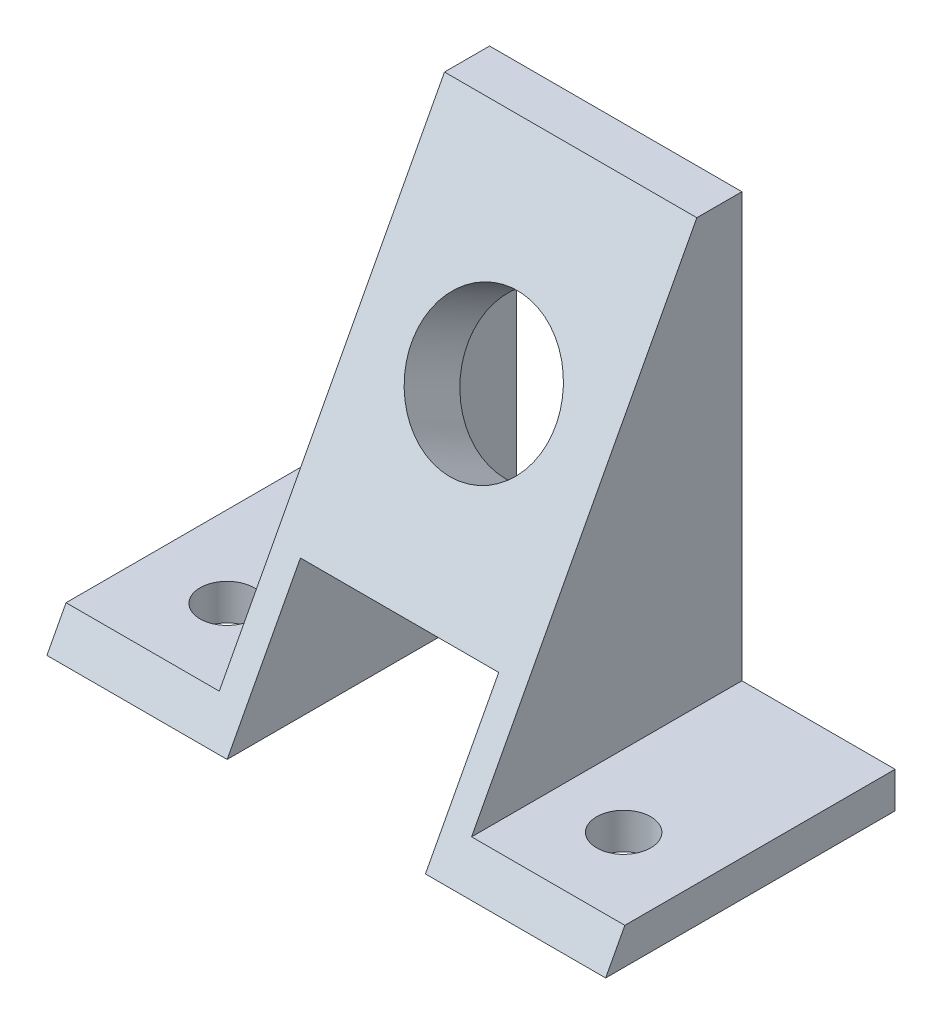
ISO-10303-21;
HEADER;
FILE_DESCRIPTION(('STEP AP214'),'2;1');
FILE_NAME('part.step','',(''),(''),'','','');
FILE_SCHEMA(('AUTOMOTIVE_DESIGN { 1 0 10303 214 1 1 1 1 }'));
ENDSEC;
DATA;
#1=APPLICATION_CONTEXT('core data for automotive mechanical design processes');
#2=APPLICATION_PROTOCOL_DEFINITION('international standard','automotive_design',2000,#1);
#3=PRODUCT_CONTEXT('',#1,'mechanical');
#4=PRODUCT('Part','Part','',(#3));
#5=PRODUCT_RELATED_PRODUCT_CATEGORY('part','',(#4));
#6=PRODUCT_DEFINITION_FORMATION('','',#4);
#7=PRODUCT_DEFINITION_CONTEXT('part definition',#1,'design');
#8=PRODUCT_DEFINITION('design','',#6,#7);
#9=PRODUCT_DEFINITION_SHAPE('','',#8);
#10=(LENGTH_UNIT() NAMED_UNIT(*) SI_UNIT(.MILLI.,.METRE.));
#11=(NAMED_UNIT(*) PLANE_ANGLE_UNIT() SI_UNIT($,.RADIAN.));
#12=(NAMED_UNIT(*) SI_UNIT($,.STERADIAN.) SOLID_ANGLE_UNIT());
#13=UNCERTAINTY_MEASURE_WITH_UNIT(LENGTH_MEASURE(1.E-05),#10,'distance_accuracy_value','');
#14=(GEOMETRIC_REPRESENTATION_CONTEXT(3) GLOBAL_UNCERTAINTY_ASSIGNED_CONTEXT((#13)) GLOBAL_UNIT_ASSIGNED_CONTEXT((#10,
#11,#12)) REPRESENTATION_CONTEXT('',''));
#15=CARTESIAN_POINT('',(0.,0.,0.));
#16=DIRECTION('',(0.,0.,1.));
#17=DIRECTION('',(1.,0.,0.));
#18=AXIS2_PLACEMENT_3D('',#15,#16,#17);
#19=CARTESIAN_POINT('',(14.,-7.67109937307166,-13.3100752591535));
#20=DIRECTION('',(0.,1.,0.));
#21=DIRECTION('',(0.,0.,1.));
#22=AXIS2_PLACEMENT_3D('',#19,#20,#21);
#23=PLANE('',#22);
#24=CARTESIAN_POINT('',(22.,-7.67109937307166,2.80710575558222));
#25=DIRECTION('',(0.,1.,0.));
#26=DIRECTION('',(0.,0.,1.));
#27=AXIS2_PLACEMENT_3D('',#24,#25,#26);
#28=CIRCLE('',#27,3.);
#29=CARTESIAN_POINT('',(22.,-7.67109937307167,5.80710575558222));
#30=VERTEX_POINT('',#29);
#31=EDGE_CURVE('E165',#30,#30,#28,.T.);
#32=ORIENTED_EDGE('',*,*,#31,.T.);
#33=EDGE_LOOP('',(#32));
#34=FACE_BOUND('',#33,.T.);
#35=DIRECTION('',(-1.,0.,0.));
#36=VECTOR('',#35,1.);
#37=CARTESIAN_POINT('',(14.,-7.67109937307167,13.8071057555822));
#38=LINE('',#37,#36);
#39=CARTESIAN_POINT('',(31.,-7.67109937307167,13.8071057555822));
#40=VERTEX_POINT('',#39);
#41=CARTESIAN_POINT('',(11.,-7.67109937307166,13.8071057555822));
#42=VERTEX_POINT('',#41);
#43=EDGE_CURVE('E142',#40,#42,#38,.T.);
#44=ORIENTED_EDGE('',*,*,#43,.T.);
#45=DIRECTION('',(0.,0.,1.));
#46=VECTOR('',#45,1.);
#47=CARTESIAN_POINT('',(11.,-7.67109937307166,-13.3100752591535));
#48=LINE('',#47,#46);
#49=CARTESIAN_POINT('',(11.,-7.67109937307166,-18.3100752591535));
#50=VERTEX_POINT('',#49);
#51=EDGE_CURVE('E211',#50,#42,#48,.T.);
#52=ORIENTED_EDGE('',*,*,#51,.F.);
#53=DIRECTION('',(-1.,0.,0.));
#54=VECTOR('',#53,1.);
#55=CARTESIAN_POINT('',(14.,-7.67109937307166,-18.3100752591535));
#56=LINE('',#55,#54);
#57=CARTESIAN_POINT('',(31.,-7.67109937307166,-18.3100752591535));
#58=VERTEX_POINT('',#57);
#59=EDGE_CURVE('E220',#58,#50,#56,.T.);
#60=ORIENTED_EDGE('',*,*,#59,.F.);
#61=DIRECTION('',(0.,0.,-1.));
#62=VECTOR('',#61,1.);
#63=CARTESIAN_POINT('',(31.,-7.67109937307166,-18.3100752591535));
#64=LINE('',#63,#62);
#65=EDGE_CURVE('E168',#40,#58,#64,.T.);
#66=ORIENTED_EDGE('',*,*,#65,.F.);
#67=EDGE_LOOP('',(#44,#52,#60,#66));
#68=FACE_BOUND('',#67,.T.);
#69=ADVANCED_FACE('F33',(#34,#68),#23,.F.);
#70=CARTESIAN_POINT('',(-22.,-7.67109937307166,2.80710575558222));
#71=DIRECTION('',(0.,1.,0.));
#72=DIRECTION('',(0.,0.,1.));
#73=AXIS2_PLACEMENT_3D('',#70,#71,#72);
#74=CIRCLE('',#73,3.);
#75=CARTESIAN_POINT('',(-22.,-7.67109937307167,5.80710575558222));
#76=VERTEX_POINT('',#75);
#77=EDGE_CURVE('E241',#76,#76,#74,.T.);
#78=ORIENTED_EDGE('',*,*,#77,.T.);
#79=EDGE_LOOP('',(#78));
#80=FACE_BOUND('',#79,.T.);
#81=DIRECTION('',(0.,0.,1.));
#82=VECTOR('',#81,1.);
#83=CARTESIAN_POINT('',(-11.,-7.67109937307166,-13.3100752591535));
#84=LINE('',#83,#82);
#85=CARTESIAN_POINT('',(-11.,-7.67109937307166,-18.3100752591535));
#86=VERTEX_POINT('',#85);
#87=CARTESIAN_POINT('',(-11.,-7.67109937307166,13.8071057555822));
#88=VERTEX_POINT('',#87);
#89=EDGE_CURVE('E137',#86,#88,#84,.T.);
#90=ORIENTED_EDGE('',*,*,#89,.T.);
#91=CARTESIAN_POINT('',(-31.,-7.67109937307167,13.8071057555822));
#92=VERTEX_POINT('',#91);
#93=EDGE_CURVE('E132',#88,#92,#38,.T.);
#94=ORIENTED_EDGE('',*,*,#93,.T.);
#95=DIRECTION('',(0.,0.,-1.));
#96=VECTOR('',#95,1.);
#97=CARTESIAN_POINT('',(-31.,-7.67109937307166,-18.3100752591535));
#98=LINE('',#97,#96);
#99=CARTESIAN_POINT('',(-31.,-7.67109937307166,-18.3100752591535));
#100=VERTEX_POINT('',#99);
#101=EDGE_CURVE('E135',#92,#100,#98,.T.);
#102=ORIENTED_EDGE('',*,*,#101,.T.);
#103=EDGE_CURVE('E219',#86,#100,#56,.T.);
#104=ORIENTED_EDGE('',*,*,#103,.F.);
#105=EDGE_LOOP('',(#90,#94,#102,#104));
#106=FACE_BOUND('',#105,.T.);
#107=ADVANCED_FACE('F35',(#80,#106),#23,.F.);
#108=CARTESIAN_POINT('',(14.,-7.67109937307167,13.8071057555822));
#109=DIRECTION('',(0.,-0.469471562785895,-0.882947592858925));
#110=DIRECTION('',(0.,0.882947592858925,-0.469471562785895));
#111=AXIS2_PLACEMENT_3D('',#108,#109,#110);
#112=PLANE('',#111);
#113=CARTESIAN_POINT('',(0.,25.1973327477471,-3.66934960698242));
#114=DIRECTION('',(0.,0.469471562785895,0.882947592858925));
#115=DIRECTION('',(0.,-0.882947592858925,0.469471562785895));
#116=AXIS2_PLACEMENT_3D('',#113,#114,#115);
#117=CIRCLE('',#116,8.);
#118=CARTESIAN_POINT('',(0.,18.1337520048757,0.0864228953047354));
#119=VERTEX_POINT('',#118);
#120=EDGE_CURVE('E214',#119,#119,#117,.T.);
#121=ORIENTED_EDGE('',*,*,#120,.F.);
#122=EDGE_LOOP('',(#121));
#123=FACE_BOUND('',#122,.T.);
#124=DIRECTION('',(1.,0.,0.));
#125=VECTOR('',#124,1.);
#126=CARTESIAN_POINT('',(14.,7.62551807535707,5.67374998573502));
#127=LINE('',#126,#125);
#128=CARTESIAN_POINT('',(-11.,7.62551807535708,5.67374998573502));
#129=VERTEX_POINT('',#128);
#130=CARTESIAN_POINT('',(11.,7.62551807535707,5.67374998573502));
#131=VERTEX_POINT('',#130);
#132=EDGE_CURVE('E192',#129,#131,#127,.T.);
#133=ORIENTED_EDGE('',*,*,#132,.T.);
#134=DIRECTION('',(0.,-0.882947592858925,0.469471562785895));
#135=VECTOR('',#134,1.);
#136=CARTESIAN_POINT('',(11.,-7.67109937307167,13.8071057555822));
#137=LINE('',#136,#135);
#138=EDGE_CURVE('E194',#131,#42,#137,.T.);
#139=ORIENTED_EDGE('',*,*,#138,.T.);
#140=ORIENTED_EDGE('',*,*,#43,.F.);
#141=DIRECTION('',(0.,-0.882947592858925,0.469471562785895));
#142=VECTOR('',#141,1.);
#143=CARTESIAN_POINT('',(31.,-7.67109937307167,13.8071057555822));
#144=LINE('',#143,#142);
#145=CARTESIAN_POINT('',(31.,-3.67109937307166,11.6802680289363));
#146=VERTEX_POINT('',#145);
#147=EDGE_CURVE('E175',#146,#40,#144,.T.);
#148=ORIENTED_EDGE('',*,*,#147,.F.);
#149=DIRECTION('',(-1.,0.,0.));
#150=VECTOR('',#149,1.);
#151=CARTESIAN_POINT('',(31.,-3.67109937307166,11.6802680289363));
#152=LINE('',#151,#150);
#153=CARTESIAN_POINT('',(14.,-3.67109937307166,11.6802680289363));
#154=VERTEX_POINT('',#153);
#155=EDGE_CURVE('E178',#146,#154,#152,.T.);
#156=ORIENTED_EDGE('',*,*,#155,.T.);
#157=DIRECTION('',(0.,-0.882947592858925,0.469471562785895));
#158=VECTOR('',#157,1.);
#159=CARTESIAN_POINT('',(14.,-7.67109937307167,13.8071057555822));
#160=LINE('',#159,#158);
#161=CARTESIAN_POINT('',(14.,43.3289006269283,-13.3100752591535));
#162=VERTEX_POINT('',#161);
#163=EDGE_CURVE('E143',#162,#154,#160,.T.);
#164=ORIENTED_EDGE('',*,*,#163,.F.);
#165=DIRECTION('',(-1.,0.,0.));
#166=VECTOR('',#165,1.);
#167=CARTESIAN_POINT('',(14.,43.3289006269283,-13.3100752591535));
#168=LINE('',#167,#166);
#169=CARTESIAN_POINT('',(-14.,43.3289006269283,-13.3100752591535));
#170=VERTEX_POINT('',#169);
#171=EDGE_CURVE('E42',#162,#170,#168,.T.);
#172=ORIENTED_EDGE('',*,*,#171,.T.);
#173=DIRECTION('',(0.,-0.882947592858925,0.469471562785895));
#174=VECTOR('',#173,1.);
#175=CARTESIAN_POINT('',(-14.,-7.67109937307167,13.8071057555822));
#176=LINE('',#175,#174);
#177=CARTESIAN_POINT('',(-14.,-3.67109937307166,11.6802680289363));
#178=VERTEX_POINT('',#177);
#179=EDGE_CURVE('E233',#170,#178,#176,.T.);
#180=ORIENTED_EDGE('',*,*,#179,.T.);
#181=DIRECTION('',(1.,0.,0.));
#182=VECTOR('',#181,1.);
#183=CARTESIAN_POINT('',(-31.,-3.67109937307166,11.6802680289363));
#184=LINE('',#183,#182);
#185=CARTESIAN_POINT('',(-31.,-3.67109937307166,11.6802680289363));
#186=VERTEX_POINT('',#185);
#187=EDGE_CURVE('E50',#186,#178,#184,.T.);
#188=ORIENTED_EDGE('',*,*,#187,.F.);
#189=DIRECTION('',(0.,-0.882947592858925,0.469471562785895));
#190=VECTOR('',#189,1.);
#191=CARTESIAN_POINT('',(-31.,-7.67109937307167,13.8071057555822));
#192=LINE('',#191,#190);
#193=EDGE_CURVE('E149',#186,#92,#192,.T.);
#194=ORIENTED_EDGE('',*,*,#193,.T.);
#195=ORIENTED_EDGE('',*,*,#93,.F.);
#196=DIRECTION('',(0.,0.882947592858925,-0.469471562785895));
#197=VECTOR('',#196,1.);
#198=CARTESIAN_POINT('',(-11.,-7.67109937307167,13.8071057555822));
#199=LINE('',#198,#197);
#200=EDGE_CURVE('E189',#88,#129,#199,.T.);
#201=ORIENTED_EDGE('',*,*,#200,.T.);
#202=EDGE_LOOP('',(#133,#139,#140,#148,#156,#164,#172,#180,#188,#194,#195,#201));
#203=FACE_BOUND('',#202,.T.);
#204=ADVANCED_FACE('F155',(#123,#203),#112,.F.);
#205=CARTESIAN_POINT('',(14.,0.,0.));
#206=DIRECTION('',(1.,0.,0.));
#207=DIRECTION('',(0.,0.,-1.));
#208=AXIS2_PLACEMENT_3D('',#205,#206,#207);
#209=PLANE('',#208);
#210=DIRECTION('',(0.,0.,1.));
#211=VECTOR('',#210,1.);
#212=CARTESIAN_POINT('',(14.,-3.67109937307166,11.6802680289363));
#213=LINE('',#212,#211);
#214=CARTESIAN_POINT('',(14.,-3.67109937307166,-18.3100752591535));
#215=VERTEX_POINT('',#214);
#216=EDGE_CURVE('E58',#215,#154,#213,.T.);
#217=ORIENTED_EDGE('',*,*,#216,.F.);
#218=DIRECTION('',(0.,-1.,0.));
#219=VECTOR('',#218,1.);
#220=CARTESIAN_POINT('',(14.,43.3289006269283,-18.3100752591535));
#221=LINE('',#220,#219);
#222=CARTESIAN_POINT('',(14.,43.3289006269283,-18.3100752591535));
#223=VERTEX_POINT('',#222);
#224=EDGE_CURVE('E217',#223,#215,#221,.T.);
#225=ORIENTED_EDGE('',*,*,#224,.F.);
#226=DIRECTION('',(0.,0.,1.));
#227=VECTOR('',#226,1.);
#228=CARTESIAN_POINT('',(14.,43.3289006269283,-18.3100752591535));
#229=LINE('',#228,#227);
#230=EDGE_CURVE('E227',#223,#162,#229,.T.);
#231=ORIENTED_EDGE('',*,*,#230,.T.);
#232=ORIENTED_EDGE('',*,*,#163,.T.);
#233=EDGE_LOOP('',(#217,#225,#231,#232));
#234=FACE_BOUND('',#233,.T.);
#235=ADVANCED_FACE('F271',(#234),#209,.T.);
#236=CARTESIAN_POINT('',(-14.,0.,0.));
#237=DIRECTION('',(1.,0.,0.));
#238=DIRECTION('',(0.,0.,-1.));
#239=AXIS2_PLACEMENT_3D('',#236,#237,#238);
#240=PLANE('',#239);
#241=DIRECTION('',(0.,1.,0.));
#242=VECTOR('',#241,1.);
#243=CARTESIAN_POINT('',(-14.,43.3289006269283,-18.3100752591535));
#244=LINE('',#243,#242);
#245=CARTESIAN_POINT('',(-14.,-3.67109937307166,-18.3100752591535));
#246=VERTEX_POINT('',#245);
#247=CARTESIAN_POINT('',(-14.,43.3289006269283,-18.3100752591535));
#248=VERTEX_POINT('',#247);
#249=EDGE_CURVE('E223',#246,#248,#244,.T.);
#250=ORIENTED_EDGE('',*,*,#249,.F.);
#251=DIRECTION('',(0.,0.,1.));
#252=VECTOR('',#251,1.);
#253=CARTESIAN_POINT('',(-14.,-3.67109937307166,11.6802680289363));
#254=LINE('',#253,#252);
#255=EDGE_CURVE('E152',#246,#178,#254,.T.);
#256=ORIENTED_EDGE('',*,*,#255,.T.);
#257=ORIENTED_EDGE('',*,*,#179,.F.);
#258=DIRECTION('',(0.,0.,1.));
#259=VECTOR('',#258,1.);
#260=CARTESIAN_POINT('',(-14.,43.3289006269283,-18.3100752591535));
#261=LINE('',#260,#259);
#262=EDGE_CURVE('E230',#248,#170,#261,.T.);
#263=ORIENTED_EDGE('',*,*,#262,.F.);
#264=EDGE_LOOP('',(#250,#256,#257,#263));
#265=FACE_BOUND('',#264,.T.);
#266=ADVANCED_FACE('F276',(#265),#240,.F.);
#267=CARTESIAN_POINT('',(14.,43.3289006269283,-18.3100752591535));
#268=DIRECTION('',(0.,-1.,0.));
#269=DIRECTION('',(0.,0.,-1.));
#270=AXIS2_PLACEMENT_3D('',#267,#268,#269);
#271=PLANE('',#270);
#272=ORIENTED_EDGE('',*,*,#171,.F.);
#273=ORIENTED_EDGE('',*,*,#230,.F.);
#274=DIRECTION('',(1.,0.,0.));
#275=VECTOR('',#274,1.);
#276=CARTESIAN_POINT('',(14.,43.3289006269283,-18.3100752591535));
#277=LINE('',#276,#275);
#278=EDGE_CURVE('E225',#248,#223,#277,.T.);
#279=ORIENTED_EDGE('',*,*,#278,.F.);
#280=ORIENTED_EDGE('',*,*,#262,.T.);
#281=EDGE_LOOP('',(#272,#273,#279,#280));
#282=FACE_BOUND('',#281,.T.);
#283=ADVANCED_FACE('F281',(#282),#271,.F.);
#284=CARTESIAN_POINT('',(0.,0.,-18.3100752591535));
#285=DIRECTION('',(0.,0.,-1.));
#286=DIRECTION('',(0.,1.,0.));
#287=AXIS2_PLACEMENT_3D('',#284,#285,#286);
#288=PLANE('',#287);
#289=DIRECTION('',(0.,1.,0.));
#290=VECTOR('',#289,1.);
#291=CARTESIAN_POINT('',(-11.,4.82243087383334,-18.3100752591535));
#292=LINE('',#291,#290);
#293=CARTESIAN_POINT('',(-11.,37.8221516763334,-18.3100752591535));
#294=VERTEX_POINT('',#293);
#295=EDGE_CURVE('E198',#86,#294,#292,.T.);
#296=ORIENTED_EDGE('',*,*,#295,.F.);
#297=ORIENTED_EDGE('',*,*,#103,.T.);
#298=DIRECTION('',(0.,1.,0.));
#299=VECTOR('',#298,1.);
#300=CARTESIAN_POINT('',(-31.,-3.67109937307166,-18.3100752591535));
#301=LINE('',#300,#299);
#302=CARTESIAN_POINT('',(-31.,-3.67109937307166,-18.3100752591535));
#303=VERTEX_POINT('',#302);
#304=EDGE_CURVE('E151',#100,#303,#301,.T.);
#305=ORIENTED_EDGE('',*,*,#304,.T.);
#306=DIRECTION('',(1.,0.,0.));
#307=VECTOR('',#306,1.);
#308=CARTESIAN_POINT('',(-31.,-3.67109937307166,-18.3100752591535));
#309=LINE('',#308,#307);
#310=EDGE_CURVE('E163',#303,#246,#309,.T.);
#311=ORIENTED_EDGE('',*,*,#310,.T.);
#312=ORIENTED_EDGE('',*,*,#249,.T.);
#313=ORIENTED_EDGE('',*,*,#278,.T.);
#314=ORIENTED_EDGE('',*,*,#224,.T.);
#315=DIRECTION('',(-1.,0.,0.));
#316=VECTOR('',#315,1.);
#317=CARTESIAN_POINT('',(31.,-3.67109937307166,-18.3100752591535));
#318=LINE('',#317,#316);
#319=CARTESIAN_POINT('',(31.,-3.67109937307166,-18.3100752591535));
#320=VERTEX_POINT('',#319);
#321=EDGE_CURVE('E182',#320,#215,#318,.T.);
#322=ORIENTED_EDGE('',*,*,#321,.F.);
#323=DIRECTION('',(0.,1.,0.));
#324=VECTOR('',#323,1.);
#325=CARTESIAN_POINT('',(31.,-3.67109937307166,-18.3100752591535));
#326=LINE('',#325,#324);
#327=EDGE_CURVE('E171',#58,#320,#326,.T.);
#328=ORIENTED_EDGE('',*,*,#327,.F.);
#329=ORIENTED_EDGE('',*,*,#59,.T.);
#330=DIRECTION('',(0.,1.,0.));
#331=VECTOR('',#330,1.);
#332=CARTESIAN_POINT('',(11.,4.82243087383334,-18.3100752591535));
#333=LINE('',#332,#331);
#334=CARTESIAN_POINT('',(11.,37.8221516763334,-18.3100752591535));
#335=VERTEX_POINT('',#334);
#336=EDGE_CURVE('E201',#50,#335,#333,.T.);
#337=ORIENTED_EDGE('',*,*,#336,.T.);
#338=DIRECTION('',(1.,0.,0.));
#339=VECTOR('',#338,1.);
#340=CARTESIAN_POINT('',(-11.,37.8221516763334,-18.3100752591535));
#341=LINE('',#340,#339);
#342=EDGE_CURVE('E204',#294,#335,#341,.T.);
#343=ORIENTED_EDGE('',*,*,#342,.F.);
#344=EDGE_LOOP('',(#296,#297,#305,#311,#312,#313,#314,#322,#328,#329,#337,#343));
#345=FACE_BOUND('',#344,.T.);
#346=ADVANCED_FACE('F286',(#345),#288,.T.);
#347=CARTESIAN_POINT('',(0.,11.8841578548633,-28.707789965813));
#348=DIRECTION('',(0.,0.469471562785895,0.882947592858925));
#349=DIRECTION('',(0.,-0.882947592858925,0.469471562785895));
#350=AXIS2_PLACEMENT_3D('',#347,#348,#349);
#351=CYLINDRICAL_SURFACE('',#350,8.);
#352=CARTESIAN_POINT('',(0.,21.9110318082459,-9.84998275699489));
#353=DIRECTION('',(0.,0.469471562785895,0.882947592858925));
#354=DIRECTION('',(0.,-0.882947592858925,0.469471562785895));
#355=AXIS2_PLACEMENT_3D('',#352,#353,#354);
#356=CIRCLE('',#355,8.);
#357=CARTESIAN_POINT('',(0.,14.8474510653745,-6.09421025470773));
#358=VERTEX_POINT('',#357);
#359=EDGE_CURVE('E210',#358,#358,#356,.F.);
#360=ORIENTED_EDGE('',*,*,#359,.T.);
#361=EDGE_LOOP('',(#360));
#362=FACE_BOUND('',#361,.T.);
#363=ORIENTED_EDGE('',*,*,#120,.T.);
#364=EDGE_LOOP('',(#363));
#365=FACE_BOUND('',#364,.T.);
#366=ADVANCED_FACE('F290',(#362,#365),#351,.F.);
#367=CARTESIAN_POINT('',(-11.,0.,0.));
#368=DIRECTION('',(-1.,0.,0.));
#369=DIRECTION('',(0.,0.,1.));
#370=AXIS2_PLACEMENT_3D('',#367,#368,#369);
#371=PLANE('',#370);
#372=ORIENTED_EDGE('',*,*,#200,.F.);
#373=ORIENTED_EDGE('',*,*,#89,.F.);
#374=ORIENTED_EDGE('',*,*,#295,.T.);
#375=DIRECTION('',(0.,-0.882947592858925,0.469471562785895));
#376=VECTOR('',#375,1.);
#377=CARTESIAN_POINT('',(-11.,37.8221516763334,-18.3100752591535));
#378=LINE('',#377,#376);
#379=CARTESIAN_POINT('',(-11.,7.62551807535706,-2.25424036908825));
#380=VERTEX_POINT('',#379);
#381=EDGE_CURVE('E200',#294,#380,#378,.T.);
#382=ORIENTED_EDGE('',*,*,#381,.T.);
#383=DIRECTION('',(0.,0.,-1.));
#384=VECTOR('',#383,1.);
#385=CARTESIAN_POINT('',(-11.,7.62551807535707,13.8071057555822));
#386=LINE('',#385,#384);
#387=EDGE_CURVE('E185',#129,#380,#386,.T.);
#388=ORIENTED_EDGE('',*,*,#387,.F.);
#389=EDGE_LOOP('',(#372,#373,#374,#382,#388));
#390=FACE_BOUND('',#389,.T.);
#391=ADVANCED_FACE('F294',(#390),#371,.F.);
#392=CARTESIAN_POINT('',(11.,0.,0.));
#393=DIRECTION('',(-1.,0.,0.));
#394=DIRECTION('',(0.,0.,1.));
#395=AXIS2_PLACEMENT_3D('',#392,#393,#394);
#396=PLANE('',#395);
#397=ORIENTED_EDGE('',*,*,#51,.T.);
#398=ORIENTED_EDGE('',*,*,#138,.F.);
#399=DIRECTION('',(0.,0.,-1.));
#400=VECTOR('',#399,1.);
#401=CARTESIAN_POINT('',(11.,7.62551807535707,13.8071057555822));
#402=LINE('',#401,#400);
#403=CARTESIAN_POINT('',(11.,7.62551807535707,-2.25424036908826));
#404=VERTEX_POINT('',#403);
#405=EDGE_CURVE('E186',#131,#404,#402,.T.);
#406=ORIENTED_EDGE('',*,*,#405,.T.);
#407=DIRECTION('',(0.,-0.882947592858925,0.469471562785895));
#408=VECTOR('',#407,1.);
#409=CARTESIAN_POINT('',(11.,37.8221516763334,-18.3100752591535));
#410=LINE('',#409,#408);
#411=EDGE_CURVE('E197',#335,#404,#410,.T.);
#412=ORIENTED_EDGE('',*,*,#411,.F.);
#413=ORIENTED_EDGE('',*,*,#336,.F.);
#414=EDGE_LOOP('',(#397,#398,#406,#412,#413));
#415=FACE_BOUND('',#414,.T.);
#416=ADVANCED_FACE('F300',(#415),#396,.T.);
#417=CARTESIAN_POINT('',(-11.,37.8221516763334,-18.3100752591535));
#418=DIRECTION('',(0.,0.469471562785895,0.882947592858925));
#419=DIRECTION('',(0.,-0.882947592858925,0.469471562785895));
#420=AXIS2_PLACEMENT_3D('',#417,#418,#419);
#421=PLANE('',#420);
#422=ORIENTED_EDGE('',*,*,#411,.T.);
#423=DIRECTION('',(-1.,0.,0.));
#424=VECTOR('',#423,1.);
#425=CARTESIAN_POINT('',(-11.,7.62551807535707,-2.25424036908826));
#426=LINE('',#425,#424);
#427=EDGE_CURVE('E11',#404,#380,#426,.T.);
#428=ORIENTED_EDGE('',*,*,#427,.T.);
#429=ORIENTED_EDGE('',*,*,#381,.F.);
#430=ORIENTED_EDGE('',*,*,#342,.T.);
#431=EDGE_LOOP('',(#422,#428,#429,#430));
#432=FACE_BOUND('',#431,.T.);
#433=ORIENTED_EDGE('',*,*,#359,.F.);
#434=EDGE_LOOP('',(#433));
#435=FACE_BOUND('',#434,.T.);
#436=ADVANCED_FACE('F296',(#432,#435),#421,.F.);
#437=CARTESIAN_POINT('',(11.,7.62551807535707,13.8071057555822));
#438=DIRECTION('',(0.,1.,0.));
#439=DIRECTION('',(0.,0.,1.));
#440=AXIS2_PLACEMENT_3D('',#437,#438,#439);
#441=PLANE('',#440);
#442=ORIENTED_EDGE('',*,*,#387,.T.);
#443=ORIENTED_EDGE('',*,*,#427,.F.);
#444=ORIENTED_EDGE('',*,*,#405,.F.);
#445=ORIENTED_EDGE('',*,*,#132,.F.);
#446=EDGE_LOOP('',(#442,#443,#444,#445));
#447=FACE_BOUND('',#446,.T.);
#448=ADVANCED_FACE('F299',(#447),#441,.F.);
#449=CARTESIAN_POINT('',(31.,-3.67109937307166,11.6802680289363));
#450=DIRECTION('',(0.,-1.,0.));
#451=DIRECTION('',(0.,0.,-1.));
#452=AXIS2_PLACEMENT_3D('',#449,#450,#451);
#453=PLANE('',#452);
#454=CARTESIAN_POINT('',(22.,-3.67109937307166,2.80710575558222));
#455=DIRECTION('',(0.,-1.,0.));
#456=DIRECTION('',(0.,0.,-1.));
#457=AXIS2_PLACEMENT_3D('',#454,#455,#456);
#458=CIRCLE('',#457,3.);
#459=CARTESIAN_POINT('',(22.,-3.67109937307166,-0.192894244417784));
#460=VERTEX_POINT('',#459);
#461=EDGE_CURVE('E37',#460,#460,#458,.T.);
#462=ORIENTED_EDGE('',*,*,#461,.T.);
#463=EDGE_LOOP('',(#462));
#464=FACE_BOUND('',#463,.T.);
#465=ORIENTED_EDGE('',*,*,#216,.T.);
#466=ORIENTED_EDGE('',*,*,#155,.F.);
#467=DIRECTION('',(0.,0.,1.));
#468=VECTOR('',#467,1.);
#469=CARTESIAN_POINT('',(31.,-3.67109937307166,11.6802680289363));
#470=LINE('',#469,#468);
#471=EDGE_CURVE('E173',#320,#146,#470,.T.);
#472=ORIENTED_EDGE('',*,*,#471,.F.);
#473=ORIENTED_EDGE('',*,*,#321,.T.);
#474=EDGE_LOOP('',(#465,#466,#472,#473));
#475=FACE_BOUND('',#474,.T.);
#476=ADVANCED_FACE('F310',(#464,#475),#453,.F.);
#477=CARTESIAN_POINT('',(31.,0.,0.));
#478=DIRECTION('',(1.,0.,0.));
#479=DIRECTION('',(0.,0.,-1.));
#480=AXIS2_PLACEMENT_3D('',#477,#478,#479);
#481=PLANE('',#480);
#482=ORIENTED_EDGE('',*,*,#65,.T.);
#483=ORIENTED_EDGE('',*,*,#327,.T.);
#484=ORIENTED_EDGE('',*,*,#471,.T.);
#485=ORIENTED_EDGE('',*,*,#147,.T.);
#486=EDGE_LOOP('',(#482,#483,#484,#485));
#487=FACE_BOUND('',#486,.T.);
#488=ADVANCED_FACE('F314',(#487),#481,.T.);
#489=CARTESIAN_POINT('',(-31.,-3.67109937307166,11.6802680289363));
#490=DIRECTION('',(0.,1.,0.));
#491=DIRECTION('',(0.,0.,1.));
#492=AXIS2_PLACEMENT_3D('',#489,#490,#491);
#493=PLANE('',#492);
#494=CARTESIAN_POINT('',(-22.,-3.67109937307166,2.80710575558222));
#495=DIRECTION('',(0.,1.,0.));
#496=DIRECTION('',(0.,0.,1.));
#497=AXIS2_PLACEMENT_3D('',#494,#495,#496);
#498=CIRCLE('',#497,3.);
#499=CARTESIAN_POINT('',(-22.,-3.67109937307166,5.80710575558222));
#500=VERTEX_POINT('',#499);
#501=EDGE_CURVE('E239',#500,#500,#498,.T.);
#502=ORIENTED_EDGE('',*,*,#501,.F.);
#503=EDGE_LOOP('',(#502));
#504=FACE_BOUND('',#503,.T.);
#505=ORIENTED_EDGE('',*,*,#255,.F.);
#506=ORIENTED_EDGE('',*,*,#310,.F.);
#507=DIRECTION('',(0.,0.,1.));
#508=VECTOR('',#507,1.);
#509=CARTESIAN_POINT('',(-31.,-3.67109937307166,11.6802680289363));
#510=LINE('',#509,#508);
#511=EDGE_CURVE('E157',#303,#186,#510,.T.);
#512=ORIENTED_EDGE('',*,*,#511,.T.);
#513=ORIENTED_EDGE('',*,*,#187,.T.);
#514=EDGE_LOOP('',(#505,#506,#512,#513));
#515=FACE_BOUND('',#514,.T.);
#516=ADVANCED_FACE('F318',(#504,#515),#493,.T.);
#517=CARTESIAN_POINT('',(-31.,0.,0.));
#518=DIRECTION('',(-1.,0.,0.));
#519=DIRECTION('',(0.,0.,-1.));
#520=AXIS2_PLACEMENT_3D('',#517,#518,#519);
#521=PLANE('',#520);
#522=ORIENTED_EDGE('',*,*,#101,.F.);
#523=ORIENTED_EDGE('',*,*,#193,.F.);
#524=ORIENTED_EDGE('',*,*,#511,.F.);
#525=ORIENTED_EDGE('',*,*,#304,.F.);
#526=EDGE_LOOP('',(#522,#523,#524,#525));
#527=FACE_BOUND('',#526,.T.);
#528=ADVANCED_FACE('F147',(#527),#521,.T.);
#529=CARTESIAN_POINT('',(-22.,43.3289006269283,2.80710575558223));
#530=DIRECTION('',(0.,-1.,0.));
#531=DIRECTION('',(0.,0.,-1.));
#532=AXIS2_PLACEMENT_3D('',#529,#530,#531);
#533=CYLINDRICAL_SURFACE('',#532,3.);
#534=ORIENTED_EDGE('',*,*,#501,.T.);
#535=EDGE_LOOP('',(#534));
#536=FACE_BOUND('',#535,.T.);
#537=ORIENTED_EDGE('',*,*,#77,.F.);
#538=EDGE_LOOP('',(#537));
#539=FACE_BOUND('',#538,.T.);
#540=ADVANCED_FACE('F256',(#536,#539),#533,.F.);
#541=CARTESIAN_POINT('',(22.,43.3289006269283,2.80710575558223));
#542=DIRECTION('',(0.,-1.,0.));
#543=DIRECTION('',(0.,0.,-1.));
#544=AXIS2_PLACEMENT_3D('',#541,#542,#543);
#545=CYLINDRICAL_SURFACE('',#544,3.);
#546=ORIENTED_EDGE('',*,*,#461,.F.);
#547=EDGE_LOOP('',(#546));
#548=FACE_BOUND('',#547,.T.);
#549=ORIENTED_EDGE('',*,*,#31,.F.);
#550=EDGE_LOOP('',(#549));
#551=FACE_BOUND('',#550,.T.);
#552=ADVANCED_FACE('F254',(#548,#551),#545,.F.);
#553=CLOSED_SHELL('',(#69,#107,#204,#235,#266,#283,#346,#366,#391,#416,#436,#448,#476,#488,#516,
#528,#540,#552));
#554=MANIFOLD_SOLID_BREP('B2',#553);
#555=ADVANCED_BREP_SHAPE_REPRESENTATION('',(#18,#554),#14);
#556=SHAPE_DEFINITION_REPRESENTATION(#9,#555);
ENDSEC;
END-ISO-10303-21;
